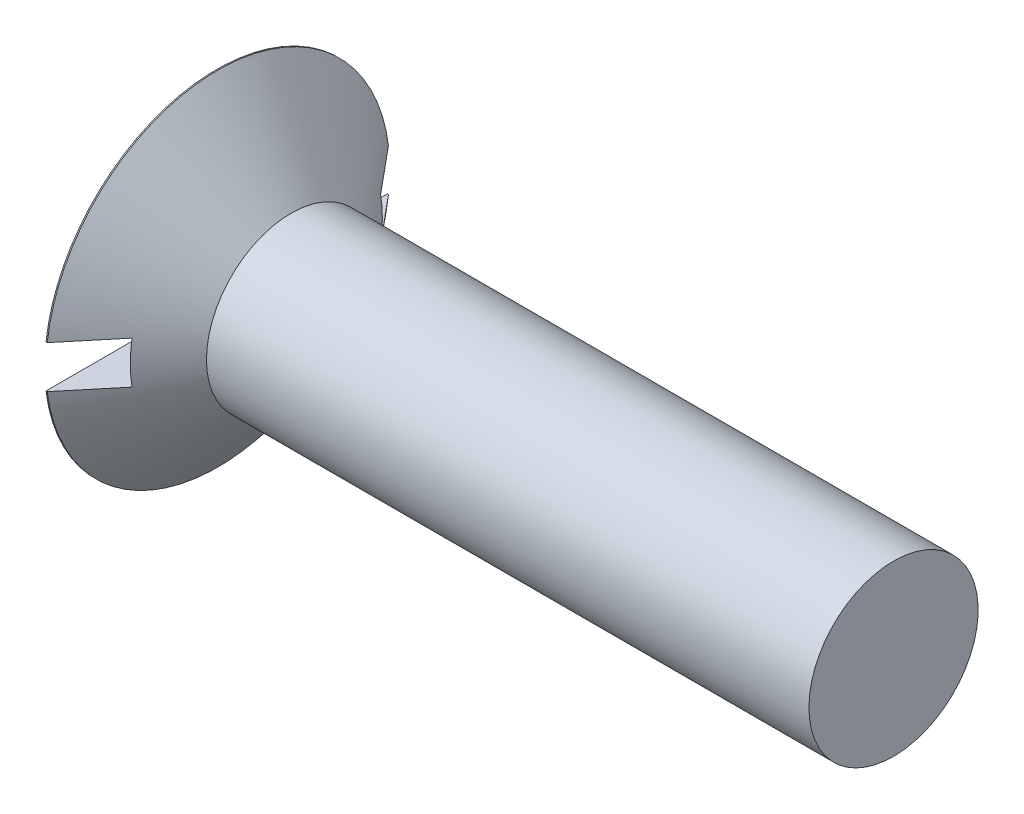
ISO-10303-21;
HEADER;
FILE_DESCRIPTION(('STEP AP214'),'2;1');
FILE_NAME('part.step','',(''),(''),'','','');
FILE_SCHEMA(('AUTOMOTIVE_DESIGN { 1 0 10303 214 1 1 1 1 }'));
ENDSEC;
DATA;
#1=APPLICATION_CONTEXT('core data for automotive mechanical design processes');
#2=APPLICATION_PROTOCOL_DEFINITION('international standard','automotive_design',2000,#1);
#3=PRODUCT_CONTEXT('',#1,'mechanical');
#4=PRODUCT('Part','Part','',(#3));
#5=PRODUCT_RELATED_PRODUCT_CATEGORY('part','',(#4));
#6=PRODUCT_DEFINITION_FORMATION('','',#4);
#7=PRODUCT_DEFINITION_CONTEXT('part definition',#1,'design');
#8=PRODUCT_DEFINITION('design','',#6,#7);
#9=PRODUCT_DEFINITION_SHAPE('','',#8);
#10=(LENGTH_UNIT() NAMED_UNIT(*) SI_UNIT(.MILLI.,.METRE.));
#11=(NAMED_UNIT(*) PLANE_ANGLE_UNIT() SI_UNIT($,.RADIAN.));
#12=(NAMED_UNIT(*) SI_UNIT($,.STERADIAN.) SOLID_ANGLE_UNIT());
#13=UNCERTAINTY_MEASURE_WITH_UNIT(LENGTH_MEASURE(1.E-05),#10,'distance_accuracy_value','');
#14=(GEOMETRIC_REPRESENTATION_CONTEXT(3) GLOBAL_UNCERTAINTY_ASSIGNED_CONTEXT((#13)) GLOBAL_UNIT_ASSIGNED_CONTEXT((#10,
#11,#12)) REPRESENTATION_CONTEXT('',''));
#15=CARTESIAN_POINT('',(0.,0.,0.));
#16=DIRECTION('',(0.,0.,1.));
#17=DIRECTION('',(1.,0.,0.));
#18=AXIS2_PLACEMENT_3D('',#15,#16,#17);
#19=CARTESIAN_POINT('',(2.2352,1.1938,-9.67739999999999));
#20=DIRECTION('',(-1.,0.,0.));
#21=DIRECTION('',(0.,0.,1.));
#22=AXIS2_PLACEMENT_3D('',#19,#20,#21);
#23=PLANE('',#22);
#24=DIRECTION('',(0.,-1.,0.));
#25=VECTOR('',#24,1.);
#26=CARTESIAN_POINT('',(2.2352,1.19379999999995,4.93366687898089));
#27=LINE('',#26,#25);
#28=CARTESIAN_POINT('',(2.2352,0.93915286624202,4.93366687898089));
#29=VERTEX_POINT('',#28);
#30=CARTESIAN_POINT('',(2.2352,-0.939152866242055,4.93366687898089));
#31=VERTEX_POINT('',#30);
#32=EDGE_CURVE('E316',#29,#31,#27,.T.);
#33=ORIENTED_EDGE('',*,*,#32,.T.);
#34=DIRECTION('',(0.,0.,-1.));
#35=VECTOR('',#34,1.);
#36=CARTESIAN_POINT('',(2.2352,-0.939152866242006,-9.6774));
#37=LINE('',#36,#35);
#38=CARTESIAN_POINT('',(2.2352,-0.939152866242041,0.939152866242038));
#39=VERTEX_POINT('',#38);
#40=EDGE_CURVE('E163',#31,#39,#37,.T.);
#41=ORIENTED_EDGE('',*,*,#40,.T.);
#42=DIRECTION('',(0.,-1.,0.));
#43=VECTOR('',#42,1.);
#44=CARTESIAN_POINT('',(2.2352,1.1938,0.939152866242037));
#45=LINE('',#44,#43);
#46=CARTESIAN_POINT('',(2.2352,-1.1938,0.939152866242037));
#47=VERTEX_POINT('',#46);
#48=EDGE_CURVE('E40',#39,#47,#45,.T.);
#49=ORIENTED_EDGE('',*,*,#48,.T.);
#50=DIRECTION('',(0.,0.,1.));
#51=VECTOR('',#50,1.);
#52=CARTESIAN_POINT('',(2.2352,-1.1938,-9.6774));
#53=LINE('',#52,#51);
#54=CARTESIAN_POINT('',(2.2352,-1.1938,6.99215244623282));
#55=VERTEX_POINT('',#54);
#56=EDGE_CURVE('E55',#47,#55,#53,.T.);
#57=ORIENTED_EDGE('',*,*,#56,.T.);
#58=CARTESIAN_POINT('',(2.2352,0.,0.));
#59=DIRECTION('',(-1.,0.,0.));
#60=DIRECTION('',(0.,0.,1.));
#61=AXIS2_PLACEMENT_3D('',#58,#59,#60);
#62=CIRCLE('',#61,7.09333167639577);
#63=CARTESIAN_POINT('',(2.2352,1.1938,6.99215244623282));
#64=VERTEX_POINT('',#63);
#65=EDGE_CURVE('E264',#64,#55,#62,.F.);
#66=ORIENTED_EDGE('',*,*,#65,.F.);
#67=DIRECTION('',(0.,0.,-1.));
#68=VECTOR('',#67,1.);
#69=CARTESIAN_POINT('',(2.2352,1.1938,9.6774));
#70=LINE('',#69,#68);
#71=CARTESIAN_POINT('',(2.2352,1.1938,0.939152866242037));
#72=VERTEX_POINT('',#71);
#73=EDGE_CURVE('E228',#64,#72,#70,.T.);
#74=ORIENTED_EDGE('',*,*,#73,.T.);
#75=CARTESIAN_POINT('',(2.2352,0.939152866242034,0.939152866242037));
#76=VERTEX_POINT('',#75);
#77=EDGE_CURVE('E11',#72,#76,#45,.T.);
#78=ORIENTED_EDGE('',*,*,#77,.T.);
#79=DIRECTION('',(0.,0.,1.));
#80=VECTOR('',#79,1.);
#81=CARTESIAN_POINT('',(2.2352,0.939152866242072,-9.67739999999999));
#82=LINE('',#81,#80);
#83=EDGE_CURVE('E317',#76,#29,#82,.T.);
#84=ORIENTED_EDGE('',*,*,#83,.T.);
#85=EDGE_LOOP('',(#33,#41,#49,#57,#66,#74,#78,#84));
#86=FACE_BOUND('',#85,.T.);
#87=ADVANCED_FACE('F32',(#86),#23,.T.);
#88=DIRECTION('',(0.,1.,0.));
#89=VECTOR('',#88,1.);
#90=CARTESIAN_POINT('',(2.2352,1.1938,-0.939152866242039));
#91=LINE('',#90,#89);
#92=CARTESIAN_POINT('',(2.2352,-1.1938,-0.939152866242039));
#93=VERTEX_POINT('',#92);
#94=CARTESIAN_POINT('',(2.2352,-0.939152866242035,-0.939152866242038));
#95=VERTEX_POINT('',#94);
#96=EDGE_CURVE('E389',#93,#95,#91,.T.);
#97=ORIENTED_EDGE('',*,*,#96,.T.);
#98=DIRECTION('',(0.,0.,-1.));
#99=VECTOR('',#98,1.);
#100=CARTESIAN_POINT('',(2.2352,-0.939152866242006,-9.6774));
#101=LINE('',#100,#99);
#102=CARTESIAN_POINT('',(2.2352,-0.939152866242022,-4.9336668789809));
#103=VERTEX_POINT('',#102);
#104=EDGE_CURVE('E189',#95,#103,#101,.T.);
#105=ORIENTED_EDGE('',*,*,#104,.T.);
#106=DIRECTION('',(0.,1.,0.));
#107=VECTOR('',#106,1.);
#108=CARTESIAN_POINT('',(2.2352,1.19379999999998,-4.93366687898089));
#109=LINE('',#108,#107);
#110=CARTESIAN_POINT('',(2.2352,0.939152866242055,-4.93366687898089));
#111=VERTEX_POINT('',#110);
#112=EDGE_CURVE('E332',#103,#111,#109,.T.);
#113=ORIENTED_EDGE('',*,*,#112,.T.);
#114=DIRECTION('',(0.,0.,1.));
#115=VECTOR('',#114,1.);
#116=CARTESIAN_POINT('',(2.2352,0.939152866242072,-9.67739999999999));
#117=LINE('',#116,#115);
#118=CARTESIAN_POINT('',(2.2352,0.939152866242041,-0.939152866242038));
#119=VERTEX_POINT('',#118);
#120=EDGE_CURVE('E322',#111,#119,#117,.T.);
#121=ORIENTED_EDGE('',*,*,#120,.T.);
#122=CARTESIAN_POINT('',(2.2352,1.1938,-0.939152866242035));
#123=VERTEX_POINT('',#122);
#124=EDGE_CURVE('E47',#119,#123,#91,.T.);
#125=ORIENTED_EDGE('',*,*,#124,.T.);
#126=CARTESIAN_POINT('',(2.2352,1.1938,-6.99215244623282));
#127=VERTEX_POINT('',#126);
#128=EDGE_CURVE('E231',#123,#127,#70,.T.);
#129=ORIENTED_EDGE('',*,*,#128,.T.);
#130=CARTESIAN_POINT('',(2.2352,-1.1938,-6.99215244623282));
#131=VERTEX_POINT('',#130);
#132=EDGE_CURVE('E268',#131,#127,#62,.F.);
#133=ORIENTED_EDGE('',*,*,#132,.F.);
#134=EDGE_CURVE('E232',#131,#93,#53,.T.);
#135=ORIENTED_EDGE('',*,*,#134,.T.);
#136=EDGE_LOOP('',(#97,#105,#113,#121,#125,#129,#133,#135));
#137=FACE_BOUND('',#136,.T.);
#138=ADVANCED_FACE('F311',(#137),#23,.T.);
#139=CARTESIAN_POINT('',(8.69008083333333,0.,0.497178541666667));
#140=DIRECTION('',(-0.0683113918583954,0.,-0.997664048536565));
#141=DIRECTION('',(-0.997664048536565,0.,0.0683113918583954));
#142=AXIS2_PLACEMENT_3D('',#139,#140,#141);
#143=PLANE('',#142);
#144=ORIENTED_EDGE('',*,*,#48,.F.);
#145=DIRECTION('',(0.995344390972083,0.0681525618022289,-0.0681525618022287));
#146=VECTOR('',#145,1.);
#147=CARTESIAN_POINT('',(8.72380707400527,-0.494869260856328,0.494869260856327));
#148=LINE('',#147,#146);
#149=CARTESIAN_POINT('',(7.9756,-0.546100000000002,0.546099999999999));
#150=VERTEX_POINT('',#149);
#151=EDGE_CURVE('E161',#39,#150,#148,.T.);
#152=ORIENTED_EDGE('',*,*,#151,.T.);
#153=DIRECTION('',(0.793328420082592,0.606365671400707,-0.0543202580629801));
#154=VECTOR('',#153,1.);
#155=CARTESIAN_POINT('',(0.,-6.6421,1.0922));
#156=LINE('',#155,#154);
#157=CARTESIAN_POINT('',(0.,-6.6421,1.0922));
#158=VERTEX_POINT('',#157);
#159=EDGE_CURVE('E186',#158,#150,#156,.T.);
#160=ORIENTED_EDGE('',*,*,#159,.F.);
#161=DIRECTION('',(0.,-1.,0.));
#162=VECTOR('',#161,1.);
#163=CARTESIAN_POINT('',(0.,6.6421,1.0922));
#164=LINE('',#163,#162);
#165=CARTESIAN_POINT('',(0.,-1.1938,1.0922));
#166=VERTEX_POINT('',#165);
#167=EDGE_CURVE('E344',#166,#158,#164,.T.);
#168=ORIENTED_EDGE('',*,*,#167,.F.);
#169=DIRECTION('',(0.997664048536565,0.,-0.0683113918583954));
#170=VECTOR('',#169,1.);
#171=CARTESIAN_POINT('',(2.95873739744039,-1.1938,0.889611292850418));
#172=LINE('',#171,#170);
#173=EDGE_CURVE('E223',#166,#47,#172,.T.);
#174=ORIENTED_EDGE('',*,*,#173,.T.);
#175=EDGE_LOOP('',(#144,#152,#160,#168,#174));
#176=FACE_BOUND('',#175,.T.);
#177=ADVANCED_FACE('F184',(#176),#143,.T.);
#178=DIRECTION('',(0.793328420082592,-0.606365671400707,-0.05432025806298));
#179=VECTOR('',#178,1.);
#180=CARTESIAN_POINT('',(0.,6.6421,1.0922));
#181=LINE('',#180,#179);
#182=CARTESIAN_POINT('',(0.,6.6421,1.0922));
#183=VERTEX_POINT('',#182);
#184=CARTESIAN_POINT('',(7.9756,0.546100000000001,0.5461));
#185=VERTEX_POINT('',#184);
#186=EDGE_CURVE('E209',#183,#185,#181,.T.);
#187=ORIENTED_EDGE('',*,*,#186,.T.);
#188=DIRECTION('',(-0.995344390972083,0.0681525618022283,0.0681525618022286));
#189=VECTOR('',#188,1.);
#190=CARTESIAN_POINT('',(8.72380707400527,0.494869260856325,0.494869260856327));
#191=LINE('',#190,#189);
#192=EDGE_CURVE('E328',#185,#76,#191,.T.);
#193=ORIENTED_EDGE('',*,*,#192,.T.);
#194=ORIENTED_EDGE('',*,*,#77,.F.);
#195=DIRECTION('',(-0.997664048536565,0.,0.0683113918583954));
#196=VECTOR('',#195,1.);
#197=CARTESIAN_POINT('',(1.63967255629894,1.1938,0.979929426877621));
#198=LINE('',#197,#196);
#199=CARTESIAN_POINT('',(0.,1.1938,1.0922));
#200=VERTEX_POINT('',#199);
#201=EDGE_CURVE('E225',#72,#200,#198,.T.);
#202=ORIENTED_EDGE('',*,*,#201,.T.);
#203=EDGE_CURVE('E345',#183,#200,#164,.T.);
#204=ORIENTED_EDGE('',*,*,#203,.F.);
#205=EDGE_LOOP('',(#187,#193,#194,#202,#204));
#206=FACE_BOUND('',#205,.T.);
#207=ADVANCED_FACE('F365',(#206),#143,.T.);
#208=CARTESIAN_POINT('',(8.69008083333333,0.,-0.497178541666667));
#209=DIRECTION('',(-0.0683113918583953,0.,0.997664048536565));
#210=DIRECTION('',(0.997664048536565,0.,0.0683113918583953));
#211=AXIS2_PLACEMENT_3D('',#208,#209,#210);
#212=PLANE('',#211);
#213=DIRECTION('',(0.793328420082592,0.606365671400707,0.0543202580629799));
#214=VECTOR('',#213,1.);
#215=CARTESIAN_POINT('',(0.,-6.6421,-1.0922));
#216=LINE('',#215,#214);
#217=CARTESIAN_POINT('',(0.,-6.6421,-1.0922));
#218=VERTEX_POINT('',#217);
#219=CARTESIAN_POINT('',(7.9756,-0.5461,-0.5461));
#220=VERTEX_POINT('',#219);
#221=EDGE_CURVE('E204',#218,#220,#216,.T.);
#222=ORIENTED_EDGE('',*,*,#221,.T.);
#223=DIRECTION('',(-0.995344390972083,-0.0681525618022284,-0.0681525618022285));
#224=VECTOR('',#223,1.);
#225=CARTESIAN_POINT('',(8.72380707400527,-0.494869260856325,-0.494869260856327));
#226=LINE('',#225,#224);
#227=EDGE_CURVE('E335',#220,#95,#226,.T.);
#228=ORIENTED_EDGE('',*,*,#227,.T.);
#229=ORIENTED_EDGE('',*,*,#96,.F.);
#230=DIRECTION('',(-0.997664048536565,0.,-0.0683113918583953));
#231=VECTOR('',#230,1.);
#232=CARTESIAN_POINT('',(1.63967255629895,-1.1938,-0.979929426877619));
#233=LINE('',#232,#231);
#234=CARTESIAN_POINT('',(0.,-1.1938,-1.0922));
#235=VERTEX_POINT('',#234);
#236=EDGE_CURVE('E219',#93,#235,#233,.T.);
#237=ORIENTED_EDGE('',*,*,#236,.T.);
#238=DIRECTION('',(0.,1.,0.));
#239=VECTOR('',#238,1.);
#240=CARTESIAN_POINT('',(0.,-6.6421,-1.0922));
#241=LINE('',#240,#239);
#242=EDGE_CURVE('E207',#218,#235,#241,.T.);
#243=ORIENTED_EDGE('',*,*,#242,.F.);
#244=EDGE_LOOP('',(#222,#228,#229,#237,#243));
#245=FACE_BOUND('',#244,.T.);
#246=ADVANCED_FACE('F388',(#245),#212,.T.);
#247=ORIENTED_EDGE('',*,*,#124,.F.);
#248=DIRECTION('',(0.995344390972083,-0.0681525618022288,0.0681525618022285));
#249=VECTOR('',#248,1.);
#250=CARTESIAN_POINT('',(8.72380707400527,0.494869260856329,-0.494869260856327));
#251=LINE('',#250,#249);
#252=CARTESIAN_POINT('',(7.9756,0.546100000000002,-0.546099999999998));
#253=VERTEX_POINT('',#252);
#254=EDGE_CURVE('E318',#119,#253,#251,.T.);
#255=ORIENTED_EDGE('',*,*,#254,.T.);
#256=DIRECTION('',(0.793328420082592,-0.606365671400707,0.0543202580629799));
#257=VECTOR('',#256,1.);
#258=CARTESIAN_POINT('',(0.,6.6421,-1.0922));
#259=LINE('',#258,#257);
#260=CARTESIAN_POINT('',(0.,6.6421,-1.0922));
#261=VERTEX_POINT('',#260);
#262=EDGE_CURVE('E198',#261,#253,#259,.T.);
#263=ORIENTED_EDGE('',*,*,#262,.F.);
#264=CARTESIAN_POINT('',(0.,1.1938,-1.0922));
#265=VERTEX_POINT('',#264);
#266=EDGE_CURVE('E203',#265,#261,#241,.T.);
#267=ORIENTED_EDGE('',*,*,#266,.F.);
#268=DIRECTION('',(0.997664048536565,0.,0.0683113918583953));
#269=VECTOR('',#268,1.);
#270=CARTESIAN_POINT('',(2.95873739744039,1.1938,-0.88961129285042));
#271=LINE('',#270,#269);
#272=EDGE_CURVE('E221',#265,#123,#271,.T.);
#273=ORIENTED_EDGE('',*,*,#272,.T.);
#274=EDGE_LOOP('',(#247,#255,#263,#267,#273));
#275=FACE_BOUND('',#274,.T.);
#276=ADVANCED_FACE('F375',(#275),#212,.T.);
#277=CARTESIAN_POINT('',(0.,0.,0.));
#278=DIRECTION('',(-1.,0.,0.));
#279=DIRECTION('',(0.,0.,1.));
#280=AXIS2_PLACEMENT_3D('',#277,#278,#279);
#281=PLANE('',#280);
#282=DIRECTION('',(0.,0.,1.));
#283=VECTOR('',#282,1.);
#284=CARTESIAN_POINT('',(0.,6.6421,-1.0922));
#285=LINE('',#284,#283);
#286=EDGE_CURVE('E341',#261,#183,#285,.T.);
#287=ORIENTED_EDGE('',*,*,#286,.T.);
#288=ORIENTED_EDGE('',*,*,#203,.T.);
#289=DIRECTION('',(0.,0.,-1.));
#290=VECTOR('',#289,1.);
#291=CARTESIAN_POINT('',(0.,1.1938,9.6774));
#292=LINE('',#291,#290);
#293=CARTESIAN_POINT('',(0.,1.1938,9.60348438432634));
#294=VERTEX_POINT('',#293);
#295=EDGE_CURVE('E236',#294,#200,#292,.T.);
#296=ORIENTED_EDGE('',*,*,#295,.F.);
#297=CARTESIAN_POINT('',(0.,0.,0.));
#298=DIRECTION('',(-1.,0.,0.));
#299=DIRECTION('',(0.,0.,1.));
#300=AXIS2_PLACEMENT_3D('',#297,#298,#299);
#301=CIRCLE('',#300,9.6774);
#302=CARTESIAN_POINT('',(0.,1.1938,-9.60348438432634));
#303=VERTEX_POINT('',#302);
#304=EDGE_CURVE('E263',#294,#303,#301,.T.);
#305=ORIENTED_EDGE('',*,*,#304,.T.);
#306=EDGE_CURVE('E227',#265,#303,#292,.T.);
#307=ORIENTED_EDGE('',*,*,#306,.F.);
#308=ORIENTED_EDGE('',*,*,#266,.T.);
#309=EDGE_LOOP('',(#287,#288,#296,#305,#307,#308));
#310=FACE_BOUND('',#309,.T.);
#311=ADVANCED_FACE('F34',(#310),#281,.T.);
#312=DIRECTION('',(0.,0.,1.));
#313=VECTOR('',#312,1.);
#314=CARTESIAN_POINT('',(0.,-1.1938,-9.6774));
#315=LINE('',#314,#313);
#316=CARTESIAN_POINT('',(0.,-1.1938,9.60348438432634));
#317=VERTEX_POINT('',#316);
#318=EDGE_CURVE('E239',#166,#317,#315,.T.);
#319=ORIENTED_EDGE('',*,*,#318,.F.);
#320=ORIENTED_EDGE('',*,*,#167,.T.);
#321=DIRECTION('',(0.,0.,-1.));
#322=VECTOR('',#321,1.);
#323=CARTESIAN_POINT('',(0.,-6.6421,1.0922));
#324=LINE('',#323,#322);
#325=EDGE_CURVE('E202',#158,#218,#324,.T.);
#326=ORIENTED_EDGE('',*,*,#325,.T.);
#327=ORIENTED_EDGE('',*,*,#242,.T.);
#328=CARTESIAN_POINT('',(0.,-1.1938,-9.60348438432634));
#329=VERTEX_POINT('',#328);
#330=EDGE_CURVE('E240',#329,#235,#315,.T.);
#331=ORIENTED_EDGE('',*,*,#330,.F.);
#332=EDGE_CURVE('E260',#329,#317,#301,.T.);
#333=ORIENTED_EDGE('',*,*,#332,.T.);
#334=EDGE_LOOP('',(#319,#320,#326,#327,#331,#333));
#335=FACE_BOUND('',#334,.T.);
#336=ADVANCED_FACE('F296',(#335),#281,.T.);
#337=CARTESIAN_POINT('',(2.2352,1.1938,9.6774));
#338=DIRECTION('',(0.,1.,0.));
#339=DIRECTION('',(0.,0.,1.));
#340=AXIS2_PLACEMENT_3D('',#337,#338,#339);
#341=PLANE('',#340);
#342=ORIENTED_EDGE('',*,*,#201,.F.);
#343=ORIENTED_EDGE('',*,*,#73,.F.);
#344=CARTESIAN_POINT('',(-9.76654593164914,1.1938,-21.3631259383791));
#345=CARTESIAN_POINT('',(-9.09525937896427,1.1938,-20.5618561872628));
#346=CARTESIAN_POINT('',(-8.42402942184396,1.1938,-19.7605389922674));
#347=CARTESIAN_POINT('',(-7.08174656529872,1.1938,-18.1577081627407));
#348=CARTESIAN_POINT('',(-6.410693672967,1.1938,-17.3561945222694));
#349=CARTESIAN_POINT('',(-5.06835999478433,1.1938,-15.7523090009415));
#350=CARTESIAN_POINT('',(-4.39707943091825,1.1938,-14.9499369342687));
#351=CARTESIAN_POINT('',(-3.05500547673588,1.1938,-13.344832799566));
#352=CARTESIAN_POINT('',(-2.38421207030887,1.1938,-12.5421007450077));
#353=CARTESIAN_POINT('',(-1.08974214453766,1.1938,-10.9914684766259));
#354=CARTESIAN_POINT('',(-0.466012830989505,1.1938,-10.2436123638055));
#355=CARTESIAN_POINT('',(0.468629921489955,1.1938,-9.12096941168539));
#356=CARTESIAN_POINT('',(0.780035340405338,1.1938,-8.74659222952008));
#357=CARTESIAN_POINT('',(1.40235767845507,1.1938,-7.99743946742865));
#358=CARTESIAN_POINT('',(1.7132746034181,1.1938,-7.62266389234697));
#359=CARTESIAN_POINT('',(2.33421374657035,1.1938,-6.87268523520887));
#360=CARTESIAN_POINT('',(2.64423633183312,1.1938,-6.49748245710988));
#361=CARTESIAN_POINT('',(3.26310212902536,1.1938,-5.74607511705371));
#362=CARTESIAN_POINT('',(3.57194528724139,1.1938,-5.36987051076495));
#363=CARTESIAN_POINT('',(4.03353158308518,1.1938,-4.80425158466735));
#364=CARTESIAN_POINT('',(4.18709974598508,1.1938,-4.61551087670477));
#365=CARTESIAN_POINT('',(4.4934425309929,1.1938,-4.23738693696583));
#366=CARTESIAN_POINT('',(4.64621715651197,1.1938,-4.04800370795726));
#367=CARTESIAN_POINT('',(4.95058145187337,1.1938,-3.66830924323743));
#368=CARTESIAN_POINT('',(5.10217120583669,1.1938,-3.47799807499275));
#369=CARTESIAN_POINT('',(5.40351985730696,1.1938,-3.09593308429033));
#370=CARTESIAN_POINT('',(5.55327881261173,1.1938,-2.90417930768568));
#371=CARTESIAN_POINT('',(5.73503949390202,1.1938,-2.66748522542514));
#372=CARTESIAN_POINT('',(5.7685380756654,1.1938,-2.62369463527218));
#373=CARTESIAN_POINT('',(5.83534437577694,1.1938,-2.53596777529053));
#374=CARTESIAN_POINT('',(5.86865209308634,1.1938,-2.49203150467103));
#375=CARTESIAN_POINT('',(5.96825558737328,1.1938,-2.35996763028417));
#376=CARTESIAN_POINT('',(6.03422528026106,1.1938,-2.2715933118258));
#377=CARTESIAN_POINT('',(6.1655598629118,1.1938,-2.09319681022266));
#378=CARTESIAN_POINT('',(6.23091437982306,1.1938,-2.00316697271865));
#379=CARTESIAN_POINT('',(6.35992402493566,1.1938,-1.82192968945906));
#380=CARTESIAN_POINT('',(6.42357962679466,1.1938,-1.73072258267317));
#381=CARTESIAN_POINT('',(6.54895917751627,1.1938,-1.54585737920636));
#382=CARTESIAN_POINT('',(6.61066232471778,1.1938,-1.4521851040837));
#383=CARTESIAN_POINT('',(6.73033793041619,1.1938,-1.2622703295857));
#384=CARTESIAN_POINT('',(6.78830535652416,1.1938,-1.16602460050921));
#385=CARTESIAN_POINT('',(6.87032154010654,1.1938,-1.01940163786976));
#386=CARTESIAN_POINT('',(6.89673746242748,1.1938,-0.970361294352434));
#387=CARTESIAN_POINT('',(6.94753509366566,1.1938,-0.871242137065956));
#388=CARTESIAN_POINT('',(6.97191636263843,1.1938,-0.821163101612475));
#389=CARTESIAN_POINT('',(7.04101569893722,1.1938,-0.669329881550796));
#390=CARTESIAN_POINT('',(7.08187978249657,1.1938,-0.565655074895695));
#391=CARTESIAN_POINT('',(7.12649625042963,1.1938,-0.417525005421814));
#392=CARTESIAN_POINT('',(7.13772030765905,1.1938,-0.375315946700829));
#393=CARTESIAN_POINT('',(7.15690825639771,1.1938,-0.290148086197977));
#394=CARTESIAN_POINT('',(7.16487217380331,1.1938,-0.247189290374347));
#395=CARTESIAN_POINT('',(7.17705987506851,1.1938,-0.160931262036988));
#396=CARTESIAN_POINT('',(7.18130019489879,1.1938,-0.117634405031511));
#397=CARTESIAN_POINT('',(7.18581997140462,1.1938,-0.0308320584269585));
#398=CARTESIAN_POINT('',(7.18609962730917,1.1938,0.012673420567904));
#399=CARTESIAN_POINT('',(7.18267879720996,1.1938,0.0995364340264344));
#400=CARTESIAN_POINT('',(7.17897720385541,1.1938,0.142893923962496));
#401=CARTESIAN_POINT('',(7.16783852752721,1.1938,0.229128576149828));
#402=CARTESIAN_POINT('',(7.16040045523447,1.1938,0.27200560811339));
#403=CARTESIAN_POINT('',(7.14217709888898,1.1938,0.357256963356369));
#404=CARTESIAN_POINT('',(7.13137514507676,1.1938,0.39962766705218));
#405=CARTESIAN_POINT('',(7.10695142432286,1.1938,0.483527898356983));
#406=CARTESIAN_POINT('',(7.09333011278446,1.1938,0.525057560629226));
#407=CARTESIAN_POINT('',(7.05155357221496,1.1938,0.641262683137298));
#408=CARTESIAN_POINT('',(7.02069143144381,1.1938,0.714961370983384));
#409=CARTESIAN_POINT('',(6.95370460919302,1.1938,0.859951367703662));
#410=CARTESIAN_POINT('',(6.91757377890332,1.1938,0.931239742212284));
#411=CARTESIAN_POINT('',(6.84158229234983,1.1938,1.07213929396108));
#412=CARTESIAN_POINT('',(6.80170762713691,1.1938,1.1417428379471));
#413=CARTESIAN_POINT('',(6.71946088773381,1.1938,1.27940009701406));
#414=CARTESIAN_POINT('',(6.67708995170407,1.1938,1.34745449909285));
#415=CARTESIAN_POINT('',(6.5900430747082,1.1938,1.48318189948864));
#416=CARTESIAN_POINT('',(6.54534611851475,1.1938,1.55084134781466));
#417=CARTESIAN_POINT('',(6.45459267427967,1.1938,1.68524729097075));
#418=CARTESIAN_POINT('',(6.40853606204155,1.1938,1.75199370158027));
#419=CARTESIAN_POINT('',(6.31551801715653,1.1938,1.88460319658262));
#420=CARTESIAN_POINT('',(6.26855912382869,1.1938,1.95046806699275));
#421=CARTESIAN_POINT('',(6.17385893762874,1.1938,2.08162757987045));
#422=CARTESIAN_POINT('',(6.12611767670796,1.1938,2.14692224545867));
#423=CARTESIAN_POINT('',(5.98410270480833,1.1938,2.33925290234634));
#424=CARTESIAN_POINT('',(5.88896693615856,1.1938,2.4656518413085));
#425=CARTESIAN_POINT('',(5.69717733241733,1.1938,2.71729450061664));
#426=CARTESIAN_POINT('',(5.60052343881202,1.1938,2.84253817613796));
#427=CARTESIAN_POINT('',(5.40615432485478,1.1938,3.09222128667673));
#428=CARTESIAN_POINT('',(5.30843898444181,1.1938,3.21666062812193));
#429=CARTESIAN_POINT('',(5.11225222530465,1.1938,3.46494232473051));
#430=CARTESIAN_POINT('',(5.01378080129258,1.1938,3.58878467570879));
#431=CARTESIAN_POINT('',(4.71730922276825,1.1938,3.95993661980433));
#432=CARTESIAN_POINT('',(4.51847832872611,1.1938,4.20658220685803));
#433=CARTESIAN_POINT('',(4.11953298785209,1.1938,4.69880256251823));
#434=CARTESIAN_POINT('',(3.91941862833607,1.1938,4.94437740209918));
#435=CARTESIAN_POINT('',(3.52060792575742,1.1938,5.43207466293569));
#436=CARTESIAN_POINT('',(3.32192101760868,1.1938,5.67420480254494));
#437=CARTESIAN_POINT('',(2.92398116297748,1.1938,6.15800627813386));
#438=CARTESIAN_POINT('',(2.72472820660204,1.1938,6.39967760597007));
#439=CARTESIAN_POINT('',(2.12655720032307,1.1938,7.12398599686619));
#440=CARTESIAN_POINT('',(1.72704846978457,1.1938,7.60613510378066));
#441=CARTESIAN_POINT('',(0.871046814390566,1.1938,8.63731923425449));
#442=CARTESIAN_POINT('',(0.414424045188351,1.1938,9.18624635470304));
#443=CARTESIAN_POINT('',(-0.499483291949484,1.1938,10.2835513722639));
#444=CARTESIAN_POINT('',(-0.956767861379917,1.1938,10.8319292681309));
#445=CARTESIAN_POINT('',(-2.32939847374105,1.1938,12.4767584040929));
#446=CARTESIAN_POINT('',(-3.24535253425598,1.1938,13.5727021058739));
#447=CARTESIAN_POINT('',(-5.09535146208239,1.1938,15.7847101010366));
#448=CARTESIAN_POINT('',(-6.02941052973186,1.1938,16.9007625112222));
#449=CARTESIAN_POINT('',(-7.43073742945754,1.1938,18.5744595203244));
#450=CARTESIAN_POINT('',(-7.89784127784283,1.1938,19.132241416059));
#451=CARTESIAN_POINT('',(-8.83213491623696,1.1938,20.2477329688739));
#452=CARTESIAN_POINT('',(-9.29932470622239,1.1938,20.805442625974));
#453=CARTESIAN_POINT('',(-9.76654593164914,1.1938,21.3631259383791));
#454=B_SPLINE_CURVE_WITH_KNOTS('',3,(#344,#345,#346,#347,#348,#349,#350,#351,#352,#353,#354,
#355,#356,#357,#358,#359,#360,#361,#362,#363,#364,#365,#366,#367,#368,#369,#370,#371,#372,#373,
#374,#375,#376,#377,#378,#379,#380,#381,#382,#383,#384,#385,#386,#387,#388,#389,#390,#391,#392,
#393,#394,#395,#396,#397,#398,#399,#400,#401,#402,#403,#404,#405,#406,#407,#408,#409,#410,#411,
#412,#413,#414,#415,#416,#417,#418,#419,#420,#421,#422,#423,#424,#425,#426,#427,#428,#429,#430,
#431,#432,#433,#434,#435,#436,#437,#438,#439,#440,#441,#442,#443,#444,#445,#446,#447,#448,#449,
#450,#451,#452,#453),.UNSPECIFIED.,.F.,.F.,(4,2,2,2,2,2,2,2,2,2,2,2,2,2,2,2,2,2,2,2,2,2,2,2,2,2,
2,2,2,2,2,2,2,2,2,2,2,2,2,2,2,2,2,2,2,2,2,2,2,2,2,2,2,2,4),(0.,3.13590972967681,
6.27193024983931,9.41036393077616,12.5486886077346,15.4701501185137,16.9310347189183,
18.3919017536911,19.852044722728,21.3122534149416,22.0422220793259,22.7721876032245,
23.5021008230668,24.231990939925,24.39739280978,24.5627955789655,24.8936327210894,
25.2273703299122,25.5610138995455,25.8974694346029,26.2343691227893,26.4014275322946,
26.5685219710389,26.9015846025692,27.0325102656921,27.163434888809,27.2937751103023,
27.4241087754088,27.554478701098,27.6848831634443,27.815944415997,27.946984515076,
28.1863394742223,28.4259760413417,28.6665480374595,28.9070111825094,29.150259810119,
29.3935307262178,29.6361957345903,29.8788508572731,30.3534327917803,30.8280330634426,
31.3026875883677,31.7773454359548,32.7277625128649,33.6781156033537,34.6177585666301,
35.5574180545877,37.435892529325,39.5779535130433,41.7200193426254,46.0049431725074,
50.3709886613029,52.5535925619314,54.7361958687159),.UNSPECIFIED.);
#455=CARTESIAN_POINT('',(0.0669092227268023,1.1938,9.60348438432635));
#456=VERTEX_POINT('',#455);
#457=EDGE_CURVE('E275',#64,#456,#454,.T.);
#458=ORIENTED_EDGE('',*,*,#457,.T.);
#459=DIRECTION('',(-1.,0.,0.));
#460=VECTOR('',#459,1.);
#461=CARTESIAN_POINT('',(-6.34999999999999,1.1938,9.60348438432634));
#462=LINE('',#461,#460);
#463=EDGE_CURVE('E246',#456,#294,#462,.T.);
#464=ORIENTED_EDGE('',*,*,#463,.T.);
#465=ORIENTED_EDGE('',*,*,#295,.T.);
#466=EDGE_LOOP('',(#342,#343,#458,#464,#465));
#467=FACE_BOUND('',#466,.T.);
#468=ADVANCED_FACE('F292',(#467),#341,.F.);
#469=ORIENTED_EDGE('',*,*,#272,.F.);
#470=ORIENTED_EDGE('',*,*,#306,.T.);
#471=DIRECTION('',(-1.,0.,0.));
#472=VECTOR('',#471,1.);
#473=CARTESIAN_POINT('',(-6.34999999999999,1.1938,-9.60348438432634));
#474=LINE('',#473,#472);
#475=CARTESIAN_POINT('',(0.0669092227268023,1.1938,-9.60348438432635));
#476=VERTEX_POINT('',#475);
#477=EDGE_CURVE('E248',#303,#476,#474,.F.);
#478=ORIENTED_EDGE('',*,*,#477,.T.);
#479=EDGE_CURVE('E392',#476,#127,#454,.T.);
#480=ORIENTED_EDGE('',*,*,#479,.T.);
#481=ORIENTED_EDGE('',*,*,#128,.F.);
#482=EDGE_LOOP('',(#469,#470,#478,#480,#481));
#483=FACE_BOUND('',#482,.T.);
#484=ADVANCED_FACE('F289',(#483),#341,.F.);
#485=CARTESIAN_POINT('',(2.2352,-1.1938,-9.6774));
#486=DIRECTION('',(0.,-1.,0.));
#487=DIRECTION('',(0.,0.,-1.));
#488=AXIS2_PLACEMENT_3D('',#485,#486,#487);
#489=PLANE('',#488);
#490=ORIENTED_EDGE('',*,*,#173,.F.);
#491=ORIENTED_EDGE('',*,*,#318,.T.);
#492=DIRECTION('',(-1.,0.,0.));
#493=VECTOR('',#492,1.);
#494=CARTESIAN_POINT('',(-6.34999999999999,-1.1938,9.60348438432634));
#495=LINE('',#494,#493);
#496=CARTESIAN_POINT('',(0.0669092227268015,-1.1938,9.60348438432635));
#497=VERTEX_POINT('',#496);
#498=EDGE_CURVE('E244',#317,#497,#495,.F.);
#499=ORIENTED_EDGE('',*,*,#498,.T.);
#500=CARTESIAN_POINT('',(-9.76654593164914,-1.1938,21.3631259383791));
#501=CARTESIAN_POINT('',(-9.09525937896427,-1.1938,20.5618561872628));
#502=CARTESIAN_POINT('',(-8.42402942184396,-1.1938,19.7605389922674));
#503=CARTESIAN_POINT('',(-7.08174656529873,-1.1938,18.1577081627407));
#504=CARTESIAN_POINT('',(-6.41069367296701,-1.1938,17.3561945222694));
#505=CARTESIAN_POINT('',(-5.06835999478435,-1.1938,15.7523090009415));
#506=CARTESIAN_POINT('',(-4.39707943091827,-1.1938,14.9499369342687));
#507=CARTESIAN_POINT('',(-3.05500547673591,-1.1938,13.3448327995661));
#508=CARTESIAN_POINT('',(-2.3842120703089,-1.1938,12.5421007450078));
#509=CARTESIAN_POINT('',(-1.08974214453769,-1.1938,10.9914684766259));
#510=CARTESIAN_POINT('',(-0.466012830989533,-1.1938,10.2436123638055));
#511=CARTESIAN_POINT('',(0.46862992148993,-1.1938,9.12096941168542));
#512=CARTESIAN_POINT('',(0.780035340405314,-1.1938,8.74659222952011));
#513=CARTESIAN_POINT('',(1.40235767845505,-1.1938,7.99743946742867));
#514=CARTESIAN_POINT('',(1.71327460341808,-1.1938,7.62266389234699));
#515=CARTESIAN_POINT('',(2.33421374657033,-1.1938,6.87268523520889));
#516=CARTESIAN_POINT('',(2.64423633183311,-1.1938,6.4974824571099));
#517=CARTESIAN_POINT('',(3.26310212902535,-1.1938,5.74607511705372));
#518=CARTESIAN_POINT('',(3.57194528724138,-1.1938,5.36987051076496));
#519=CARTESIAN_POINT('',(4.03353158308518,-1.1938,4.80425158466736));
#520=CARTESIAN_POINT('',(4.18709974598507,-1.1938,4.61551087670478));
#521=CARTESIAN_POINT('',(4.4934425309929,-1.1938,4.23738693696584));
#522=CARTESIAN_POINT('',(4.64621715651197,-1.1938,4.04800370795726));
#523=CARTESIAN_POINT('',(4.95058145187336,-1.1938,3.66830924323743));
#524=CARTESIAN_POINT('',(5.10217120583669,-1.1938,3.47799807499276));
#525=CARTESIAN_POINT('',(5.40351985730696,-1.1938,3.09593308429033));
#526=CARTESIAN_POINT('',(5.55327881261173,-1.1938,2.90417930768568));
#527=CARTESIAN_POINT('',(5.73503949390202,-1.1938,2.66748522542514));
#528=CARTESIAN_POINT('',(5.7685380756654,-1.1938,2.62369463527218));
#529=CARTESIAN_POINT('',(5.83534437577694,-1.1938,2.53596777529053));
#530=CARTESIAN_POINT('',(5.86865209308634,-1.1938,2.49203150467103));
#531=CARTESIAN_POINT('',(5.96825558737327,-1.1938,2.35996763028417));
#532=CARTESIAN_POINT('',(6.03422528026106,-1.1938,2.2715933118258));
#533=CARTESIAN_POINT('',(6.1655598629118,-1.1938,2.09319681022266));
#534=CARTESIAN_POINT('',(6.23091437982306,-1.1938,2.00316697271865));
#535=CARTESIAN_POINT('',(6.35992402493566,-1.1938,1.82192968945906));
#536=CARTESIAN_POINT('',(6.42357962679466,-1.1938,1.73072258267317));
#537=CARTESIAN_POINT('',(6.54895917751627,-1.1938,1.54585737920636));
#538=CARTESIAN_POINT('',(6.61066232471778,-1.1938,1.4521851040837));
#539=CARTESIAN_POINT('',(6.73033793041618,-1.1938,1.2622703295857));
#540=CARTESIAN_POINT('',(6.78830535652416,-1.1938,1.16602460050921));
#541=CARTESIAN_POINT('',(6.87032154010654,-1.1938,1.01940163786976));
#542=CARTESIAN_POINT('',(6.89673746242748,-1.1938,0.970361294352433));
#543=CARTESIAN_POINT('',(6.94753509366565,-1.1938,0.871242137065955));
#544=CARTESIAN_POINT('',(6.97191636263843,-1.1938,0.821163101612474));
#545=CARTESIAN_POINT('',(7.04101569893722,-1.1938,0.669329881550796));
#546=CARTESIAN_POINT('',(7.08187978249657,-1.1938,0.565655074895694));
#547=CARTESIAN_POINT('',(7.12649625042963,-1.1938,0.417525005421814));
#548=CARTESIAN_POINT('',(7.13772030765905,-1.1938,0.375315946700828));
#549=CARTESIAN_POINT('',(7.15690825639771,-1.1938,0.290148086197976));
#550=CARTESIAN_POINT('',(7.16487217380331,-1.1938,0.247189290374345));
#551=CARTESIAN_POINT('',(7.17705987506851,-1.1938,0.160931262036987));
#552=CARTESIAN_POINT('',(7.18130019489879,-1.1938,0.117634405031509));
#553=CARTESIAN_POINT('',(7.18581997140462,-1.1938,0.0308320584269569));
#554=CARTESIAN_POINT('',(7.18609962730917,-1.1938,-0.0126734205679056));
#555=CARTESIAN_POINT('',(7.18267879720996,-1.1938,-0.0995364340264364));
#556=CARTESIAN_POINT('',(7.17897720385541,-1.1938,-0.142893923962498));
#557=CARTESIAN_POINT('',(7.16783852752721,-1.1938,-0.22912857614983));
#558=CARTESIAN_POINT('',(7.16040045523447,-1.1938,-0.272005608113391));
#559=CARTESIAN_POINT('',(7.14217709888898,-1.1938,-0.35725696335637));
#560=CARTESIAN_POINT('',(7.13137514507676,-1.1938,-0.39962766705218));
#561=CARTESIAN_POINT('',(7.10695142432286,-1.1938,-0.483527898356984));
#562=CARTESIAN_POINT('',(7.09333011278445,-1.1938,-0.525057560629228));
#563=CARTESIAN_POINT('',(7.05155357221496,-1.1938,-0.641262683137301));
#564=CARTESIAN_POINT('',(7.02069143144381,-1.1938,-0.714961370983388));
#565=CARTESIAN_POINT('',(6.95370460919302,-1.1938,-0.859951367703667));
#566=CARTESIAN_POINT('',(6.91757377890332,-1.1938,-0.931239742212289));
#567=CARTESIAN_POINT('',(6.84158229234983,-1.1938,-1.07213929396108));
#568=CARTESIAN_POINT('',(6.8017076271369,-1.1938,-1.1417428379471));
#569=CARTESIAN_POINT('',(6.71946088773381,-1.1938,-1.27940009701407));
#570=CARTESIAN_POINT('',(6.67708995170407,-1.1938,-1.34745449909286));
#571=CARTESIAN_POINT('',(6.59004307470819,-1.1938,-1.48318189948865));
#572=CARTESIAN_POINT('',(6.54534611851474,-1.1938,-1.55084134781466));
#573=CARTESIAN_POINT('',(6.45459267427966,-1.1938,-1.68524729097075));
#574=CARTESIAN_POINT('',(6.40853606204154,-1.1938,-1.75199370158028));
#575=CARTESIAN_POINT('',(6.31551801715652,-1.1938,-1.88460319658263));
#576=CARTESIAN_POINT('',(6.26855912382869,-1.1938,-1.95046806699276));
#577=CARTESIAN_POINT('',(6.17385893762874,-1.1938,-2.08162757987046));
#578=CARTESIAN_POINT('',(6.12611767670795,-1.1938,-2.14692224545868));
#579=CARTESIAN_POINT('',(5.98410270480832,-1.1938,-2.33925290234635));
#580=CARTESIAN_POINT('',(5.88896693615855,-1.1938,-2.46565184130851));
#581=CARTESIAN_POINT('',(5.69717733241732,-1.1938,-2.71729450061666));
#582=CARTESIAN_POINT('',(5.60052343881201,-1.1938,-2.84253817613797));
#583=CARTESIAN_POINT('',(5.40615432485477,-1.1938,-3.09222128667674));
#584=CARTESIAN_POINT('',(5.3084389844418,-1.1938,-3.21666062812194));
#585=CARTESIAN_POINT('',(5.11225222530464,-1.1938,-3.46494232473053));
#586=CARTESIAN_POINT('',(5.01378080129256,-1.1938,-3.58878467570881));
#587=CARTESIAN_POINT('',(4.71730922276824,-1.1938,-3.95993661980435));
#588=CARTESIAN_POINT('',(4.51847832872609,-1.1938,-4.20658220685805));
#589=CARTESIAN_POINT('',(4.11953298785207,-1.1938,-4.69880256251826));
#590=CARTESIAN_POINT('',(3.91941862833605,-1.1938,-4.9443774020992));
#591=CARTESIAN_POINT('',(3.5206079257574,-1.1938,-5.43207466293572));
#592=CARTESIAN_POINT('',(3.32192101760866,-1.1938,-5.67420480254497));
#593=CARTESIAN_POINT('',(2.92398116297745,-1.1938,-6.15800627813389));
#594=CARTESIAN_POINT('',(2.72472820660201,-1.1938,-6.39967760597011));
#595=CARTESIAN_POINT('',(2.12655720032303,-1.1938,-7.12398599686623));
#596=CARTESIAN_POINT('',(1.72704846978453,-1.1938,-7.60613510378071));
#597=CARTESIAN_POINT('',(0.871046814390527,-1.1938,-8.63731923425454));
#598=CARTESIAN_POINT('',(0.414424045188314,-1.1938,-9.18624635470309));
#599=CARTESIAN_POINT('',(-0.499483291949518,-1.1938,-10.2835513722639));
#600=CARTESIAN_POINT('',(-0.95676786137995,-1.1938,-10.831929268131));
#601=CARTESIAN_POINT('',(-2.32939847374108,-1.1938,-12.4767584040929));
#602=CARTESIAN_POINT('',(-3.24535253425601,-1.1938,-13.5727021058739));
#603=CARTESIAN_POINT('',(-5.09535146208241,-1.1938,-15.7847101010366));
#604=CARTESIAN_POINT('',(-6.02941052973187,-1.1938,-16.9007625112222));
#605=CARTESIAN_POINT('',(-7.43073742945755,-1.1938,-18.5744595203244));
#606=CARTESIAN_POINT('',(-7.89784127784284,-1.1938,-19.132241416059));
#607=CARTESIAN_POINT('',(-8.83213491623697,-1.1938,-20.247732968874));
#608=CARTESIAN_POINT('',(-9.29932470622239,-1.1938,-20.805442625974));
#609=CARTESIAN_POINT('',(-9.76654593164914,-1.1938,-21.3631259383791));
#610=B_SPLINE_CURVE_WITH_KNOTS('',3,(#500,#501,#502,#503,#504,#505,#506,#507,#508,#509,#510,
#511,#512,#513,#514,#515,#516,#517,#518,#519,#520,#521,#522,#523,#524,#525,#526,#527,#528,#529,
#530,#531,#532,#533,#534,#535,#536,#537,#538,#539,#540,#541,#542,#543,#544,#545,#546,#547,#548,
#549,#550,#551,#552,#553,#554,#555,#556,#557,#558,#559,#560,#561,#562,#563,#564,#565,#566,#567,
#568,#569,#570,#571,#572,#573,#574,#575,#576,#577,#578,#579,#580,#581,#582,#583,#584,#585,#586,
#587,#588,#589,#590,#591,#592,#593,#594,#595,#596,#597,#598,#599,#600,#601,#602,#603,#604,#605,
#606,#607,#608,#609),.UNSPECIFIED.,.F.,.F.,(4,2,2,2,2,2,2,2,2,2,2,2,2,2,2,2,2,2,2,2,2,2,2,2,2,2,
2,2,2,2,2,2,2,2,2,2,2,2,2,2,2,2,2,2,2,2,2,2,2,2,2,2,2,2,4),(0.,3.13590972967679,
6.27193024983928,9.41036393077612,12.5486886077346,15.4701501185136,16.9310347189183,
18.391901753691,19.852044722728,21.3122534149416,22.0422220793259,22.7721876032245,
23.5021008230668,24.231990939925,24.39739280978,24.5627955789655,24.8936327210894,
25.2273703299122,25.5610138995455,25.8974694346029,26.2343691227893,26.4014275322946,
26.5685219710389,26.9015846025692,27.0325102656921,27.163434888809,27.2937751103023,
27.4241087754088,27.554478701098,27.6848831634443,27.815944415997,27.946984515076,
28.1863394742223,28.4259760413417,28.6665480374595,28.9070111825094,29.150259810119,
29.3935307262178,29.6361957345903,29.8788508572731,30.3534327917803,30.8280330634426,
31.3026875883677,31.7773454359548,32.7277625128649,33.6781156033537,34.6177585666301,
35.5574180545877,37.4358925293251,39.5779535130433,41.7200193426254,46.0049431725074,
50.3709886613029,52.5535925619314,54.7361958687159),.UNSPECIFIED.);
#611=EDGE_CURVE('E267',#497,#55,#610,.T.);
#612=ORIENTED_EDGE('',*,*,#611,.T.);
#613=ORIENTED_EDGE('',*,*,#56,.F.);
#614=EDGE_LOOP('',(#490,#491,#499,#612,#613));
#615=FACE_BOUND('',#614,.T.);
#616=ADVANCED_FACE('F284',(#615),#489,.F.);
#617=ORIENTED_EDGE('',*,*,#236,.F.);
#618=ORIENTED_EDGE('',*,*,#134,.F.);
#619=CARTESIAN_POINT('',(0.0669092227268023,-1.1938,-9.60348438432635));
#620=VERTEX_POINT('',#619);
#621=EDGE_CURVE('E276',#131,#620,#610,.T.);
#622=ORIENTED_EDGE('',*,*,#621,.T.);
#623=DIRECTION('',(-1.,0.,0.));
#624=VECTOR('',#623,1.);
#625=CARTESIAN_POINT('',(-6.34999999999999,-1.1938,-9.60348438432634));
#626=LINE('',#625,#624);
#627=EDGE_CURVE('E235',#620,#329,#626,.T.);
#628=ORIENTED_EDGE('',*,*,#627,.T.);
#629=ORIENTED_EDGE('',*,*,#330,.T.);
#630=EDGE_LOOP('',(#617,#618,#622,#628,#629));
#631=FACE_BOUND('',#630,.T.);
#632=ADVANCED_FACE('F288',(#631),#489,.F.);
#633=CARTESIAN_POINT('',(-6.34999999999999,0.,0.));
#634=DIRECTION('',(-1.,0.,0.));
#635=DIRECTION('',(0.,0.,1.));
#636=AXIS2_PLACEMENT_3D('',#633,#634,#635);
#637=CYLINDRICAL_SURFACE('',#636,9.6774);
#638=ORIENTED_EDGE('',*,*,#477,.F.);
#639=ORIENTED_EDGE('',*,*,#304,.F.);
#640=ORIENTED_EDGE('',*,*,#463,.F.);
#641=CARTESIAN_POINT('',(0.0669092227268018,0.,0.));
#642=DIRECTION('',(-1.,0.,0.));
#643=DIRECTION('',(0.,0.,1.));
#644=AXIS2_PLACEMENT_3D('',#641,#642,#643);
#645=CIRCLE('',#644,9.6774);
#646=EDGE_CURVE('E259',#456,#476,#645,.T.);
#647=ORIENTED_EDGE('',*,*,#646,.T.);
#648=EDGE_LOOP('',(#638,#639,#640,#647));
#649=FACE_BOUND('',#648,.T.);
#650=ADVANCED_FACE('F404',(#649),#637,.T.);
#651=ORIENTED_EDGE('',*,*,#498,.F.);
#652=ORIENTED_EDGE('',*,*,#332,.F.);
#653=ORIENTED_EDGE('',*,*,#627,.F.);
#654=EDGE_CURVE('E256',#620,#497,#645,.T.);
#655=ORIENTED_EDGE('',*,*,#654,.T.);
#656=EDGE_LOOP('',(#651,#652,#653,#655));
#657=FACE_BOUND('',#656,.T.);
#658=ADVANCED_FACE('F307',(#657),#637,.T.);
#659=CARTESIAN_POINT('',(0.0669092227268018,0.,0.));
#660=DIRECTION('',(-1.,0.,0.));
#661=DIRECTION('',(0.,0.,1.));
#662=AXIS2_PLACEMENT_3D('',#659,#660,#661);
#663=CONICAL_SURFACE('',#662,9.6774,0.872664625997166);
#664=ORIENTED_EDGE('',*,*,#479,.F.);
#665=ORIENTED_EDGE('',*,*,#646,.F.);
#666=ORIENTED_EDGE('',*,*,#457,.F.);
#667=ORIENTED_EDGE('',*,*,#65,.T.);
#668=ORIENTED_EDGE('',*,*,#611,.F.);
#669=ORIENTED_EDGE('',*,*,#654,.F.);
#670=ORIENTED_EDGE('',*,*,#621,.F.);
#671=ORIENTED_EDGE('',*,*,#132,.T.);
#672=EDGE_LOOP('',(#664,#665,#666,#667,#668,#669,#670,#671));
#673=FACE_BOUND('',#672,.T.);
#674=CARTESIAN_POINT('',(4.191,0.,0.));
#675=DIRECTION('',(-1.,0.,0.));
#676=DIRECTION('',(0.,0.,1.));
#677=AXIS2_PLACEMENT_3D('',#674,#675,#676);
#678=CIRCLE('',#677,4.7625);
#679=CARTESIAN_POINT('',(4.191,0.,4.7625));
#680=VERTEX_POINT('',#679);
#681=EDGE_CURVE('E253',#680,#680,#678,.T.);
#682=ORIENTED_EDGE('',*,*,#681,.T.);
#683=EDGE_LOOP('',(#682));
#684=FACE_BOUND('',#683,.T.);
#685=ADVANCED_FACE('F281',(#673,#684),#663,.T.);
#686=CARTESIAN_POINT('',(-6.34999999999999,0.,0.));
#687=DIRECTION('',(-1.,0.,0.));
#688=DIRECTION('',(0.,0.,1.));
#689=AXIS2_PLACEMENT_3D('',#686,#687,#688);
#690=CYLINDRICAL_SURFACE('',#689,4.7625);
#691=CARTESIAN_POINT('',(38.1,0.,0.));
#692=DIRECTION('',(-1.,0.,0.));
#693=DIRECTION('',(0.,0.,1.));
#694=AXIS2_PLACEMENT_3D('',#691,#692,#693);
#695=CIRCLE('',#694,4.7625);
#696=CARTESIAN_POINT('',(38.1,0.,4.7625));
#697=VERTEX_POINT('',#696);
#698=EDGE_CURVE('E250',#697,#697,#695,.T.);
#699=ORIENTED_EDGE('',*,*,#698,.T.);
#700=EDGE_LOOP('',(#699));
#701=FACE_BOUND('',#700,.T.);
#702=ORIENTED_EDGE('',*,*,#681,.F.);
#703=EDGE_LOOP('',(#702));
#704=FACE_BOUND('',#703,.T.);
#705=ADVANCED_FACE('F300',(#701,#704),#690,.T.);
#706=CARTESIAN_POINT('',(38.1,4.7625,0.));
#707=DIRECTION('',(1.,0.,0.));
#708=DIRECTION('',(0.,0.,-1.));
#709=AXIS2_PLACEMENT_3D('',#706,#707,#708);
#710=PLANE('',#709);
#711=ORIENTED_EDGE('',*,*,#698,.F.);
#712=EDGE_LOOP('',(#711));
#713=FACE_BOUND('',#712,.T.);
#714=ADVANCED_FACE('F298',(#713),#710,.T.);
#715=CARTESIAN_POINT('',(7.9756,0.5461,-0.5461));
#716=DIRECTION('',(1.,0.,0.));
#717=DIRECTION('',(0.,0.,-1.));
#718=AXIS2_PLACEMENT_3D('',#715,#716,#717);
#719=PLANE('',#718);
#720=DIRECTION('',(0.,1.,0.));
#721=VECTOR('',#720,1.);
#722=CARTESIAN_POINT('',(7.9756,-0.5461,-0.5461));
#723=LINE('',#722,#721);
#724=EDGE_CURVE('E195',#220,#253,#723,.T.);
#725=ORIENTED_EDGE('',*,*,#724,.F.);
#726=DIRECTION('',(0.,0.,-1.));
#727=VECTOR('',#726,1.);
#728=CARTESIAN_POINT('',(7.9756,-0.5461,0.5461));
#729=LINE('',#728,#727);
#730=EDGE_CURVE('E178',#150,#220,#729,.T.);
#731=ORIENTED_EDGE('',*,*,#730,.F.);
#732=DIRECTION('',(0.,-1.,0.));
#733=VECTOR('',#732,1.);
#734=CARTESIAN_POINT('',(7.9756,0.5461,0.5461));
#735=LINE('',#734,#733);
#736=EDGE_CURVE('E170',#185,#150,#735,.T.);
#737=ORIENTED_EDGE('',*,*,#736,.F.);
#738=DIRECTION('',(0.,0.,1.));
#739=VECTOR('',#738,1.);
#740=CARTESIAN_POINT('',(7.9756,0.5461,-0.5461));
#741=LINE('',#740,#739);
#742=EDGE_CURVE('E179',#253,#185,#741,.T.);
#743=ORIENTED_EDGE('',*,*,#742,.F.);
#744=EDGE_LOOP('',(#725,#731,#737,#743));
#745=FACE_BOUND('',#744,.T.);
#746=ADVANCED_FACE('F193',(#745),#719,.F.);
#747=CARTESIAN_POINT('',(7.9756,-0.5461,-0.5461));
#748=DIRECTION('',(-0.607262254737891,0.794501449948741,0.));
#749=DIRECTION('',(-0.794501449948741,-0.607262254737891,0.));
#750=AXIS2_PLACEMENT_3D('',#747,#748,#749);
#751=PLANE('',#750);
#752=ORIENTED_EDGE('',*,*,#221,.F.);
#753=ORIENTED_EDGE('',*,*,#325,.F.);
#754=ORIENTED_EDGE('',*,*,#159,.T.);
#755=ORIENTED_EDGE('',*,*,#730,.T.);
#756=EDGE_LOOP('',(#752,#753,#754,#755));
#757=FACE_BOUND('',#756,.T.);
#758=ADVANCED_FACE('F200',(#757),#751,.T.);
#759=CARTESIAN_POINT('',(7.9756,0.5461,0.5461));
#760=DIRECTION('',(-0.607262254737891,-0.794501449948741,0.));
#761=DIRECTION('',(0.794501449948741,-0.607262254737891,0.));
#762=AXIS2_PLACEMENT_3D('',#759,#760,#761);
#763=PLANE('',#762);
#764=ORIENTED_EDGE('',*,*,#186,.F.);
#765=ORIENTED_EDGE('',*,*,#286,.F.);
#766=ORIENTED_EDGE('',*,*,#262,.T.);
#767=ORIENTED_EDGE('',*,*,#742,.T.);
#768=EDGE_LOOP('',(#764,#765,#766,#767));
#769=FACE_BOUND('',#768,.T.);
#770=ADVANCED_FACE('F373',(#769),#763,.T.);
#771=CARTESIAN_POINT('',(7.9756,-0.546100000000002,0.546099999999998));
#772=DIRECTION('',(-0.607262254737891,0.,-0.794501449948741));
#773=DIRECTION('',(0.794501449948741,0.,-0.607262254737891));
#774=AXIS2_PLACEMENT_3D('',#771,#772,#773);
#775=PLANE('',#774);
#776=DIRECTION('',(0.793328420082592,-0.0543202580629778,-0.606365671400707));
#777=VECTOR('',#776,1.);
#778=CARTESIAN_POINT('',(0.,1.09219999999998,6.6421));
#779=LINE('',#778,#777);
#780=EDGE_CURVE('E167',#29,#185,#779,.T.);
#781=ORIENTED_EDGE('',*,*,#780,.T.);
#782=ORIENTED_EDGE('',*,*,#736,.T.);
#783=DIRECTION('',(0.793328420082592,0.0543202580629821,-0.606365671400707));
#784=VECTOR('',#783,1.);
#785=CARTESIAN_POINT('',(0.,-1.09220000000002,6.6421));
#786=LINE('',#785,#784);
#787=EDGE_CURVE('E157',#31,#150,#786,.T.);
#788=ORIENTED_EDGE('',*,*,#787,.F.);
#789=ORIENTED_EDGE('',*,*,#32,.F.);
#790=EDGE_LOOP('',(#781,#782,#788,#789));
#791=FACE_BOUND('',#790,.T.);
#792=ADVANCED_FACE('F171',(#791),#775,.T.);
#793=CARTESIAN_POINT('',(8.69008083333333,0.497178541666667,0.));
#794=DIRECTION('',(-0.0683113918583953,-0.997664048536565,0.));
#795=DIRECTION('',(0.997664048536565,-0.0683113918583953,0.));
#796=AXIS2_PLACEMENT_3D('',#793,#794,#795);
#797=PLANE('',#796);
#798=ORIENTED_EDGE('',*,*,#192,.F.);
#799=ORIENTED_EDGE('',*,*,#780,.F.);
#800=ORIENTED_EDGE('',*,*,#83,.F.);
#801=EDGE_LOOP('',(#798,#799,#800));
#802=FACE_BOUND('',#801,.T.);
#803=ADVANCED_FACE('F502',(#802),#797,.T.);
#804=CARTESIAN_POINT('',(8.69008083333333,-0.497178541666667,0.));
#805=DIRECTION('',(-0.0683113918583954,0.997664048536565,0.));
#806=DIRECTION('',(-0.997664048536565,-0.0683113918583954,0.));
#807=AXIS2_PLACEMENT_3D('',#804,#805,#806);
#808=PLANE('',#807);
#809=ORIENTED_EDGE('',*,*,#787,.T.);
#810=ORIENTED_EDGE('',*,*,#151,.F.);
#811=ORIENTED_EDGE('',*,*,#40,.F.);
#812=EDGE_LOOP('',(#809,#810,#811));
#813=FACE_BOUND('',#812,.T.);
#814=ADVANCED_FACE('F159',(#813),#808,.T.);
#815=CARTESIAN_POINT('',(7.9756,0.546100000000002,-0.546099999999998));
#816=DIRECTION('',(-0.607262254737891,0.,0.794501449948741));
#817=DIRECTION('',(-0.794501449948741,0.,-0.607262254737891));
#818=AXIS2_PLACEMENT_3D('',#815,#816,#817);
#819=PLANE('',#818);
#820=DIRECTION('',(0.793328420082592,0.054320258062978,0.606365671400707));
#821=VECTOR('',#820,1.);
#822=CARTESIAN_POINT('',(0.,-1.09219999999998,-6.6421));
#823=LINE('',#822,#821);
#824=EDGE_CURVE('E319',#103,#220,#823,.T.);
#825=ORIENTED_EDGE('',*,*,#824,.T.);
#826=ORIENTED_EDGE('',*,*,#724,.T.);
#827=DIRECTION('',(0.793328420082592,-0.0543202580629821,0.606365671400707));
#828=VECTOR('',#827,1.);
#829=CARTESIAN_POINT('',(0.,1.09220000000002,-6.6421));
#830=LINE('',#829,#828);
#831=EDGE_CURVE('E166',#111,#253,#830,.T.);
#832=ORIENTED_EDGE('',*,*,#831,.F.);
#833=ORIENTED_EDGE('',*,*,#112,.F.);
#834=EDGE_LOOP('',(#825,#826,#832,#833));
#835=FACE_BOUND('',#834,.T.);
#836=ADVANCED_FACE('F383',(#835),#819,.T.);
#837=ORIENTED_EDGE('',*,*,#227,.F.);
#838=ORIENTED_EDGE('',*,*,#824,.F.);
#839=ORIENTED_EDGE('',*,*,#104,.F.);
#840=EDGE_LOOP('',(#837,#838,#839));
#841=FACE_BOUND('',#840,.T.);
#842=ADVANCED_FACE('F386',(#841),#808,.T.);
#843=ORIENTED_EDGE('',*,*,#831,.T.);
#844=ORIENTED_EDGE('',*,*,#254,.F.);
#845=ORIENTED_EDGE('',*,*,#120,.F.);
#846=EDGE_LOOP('',(#843,#844,#845));
#847=FACE_BOUND('',#846,.T.);
#848=ADVANCED_FACE('F378',(#847),#797,.T.);
#849=CLOSED_SHELL('',(#87,#138,#177,#207,#246,#276,#311,#336,#468,#484,#616,#632,#650,#658,#685,
#705,#714,#746,#758,#770,#792,#803,#814,#836,#842,#848));
#850=MANIFOLD_SOLID_BREP('B2',#849);
#851=ADVANCED_BREP_SHAPE_REPRESENTATION('',(#18,#850),#14);
#852=SHAPE_DEFINITION_REPRESENTATION(#9,#851);
ENDSEC;
END-ISO-10303-21;
